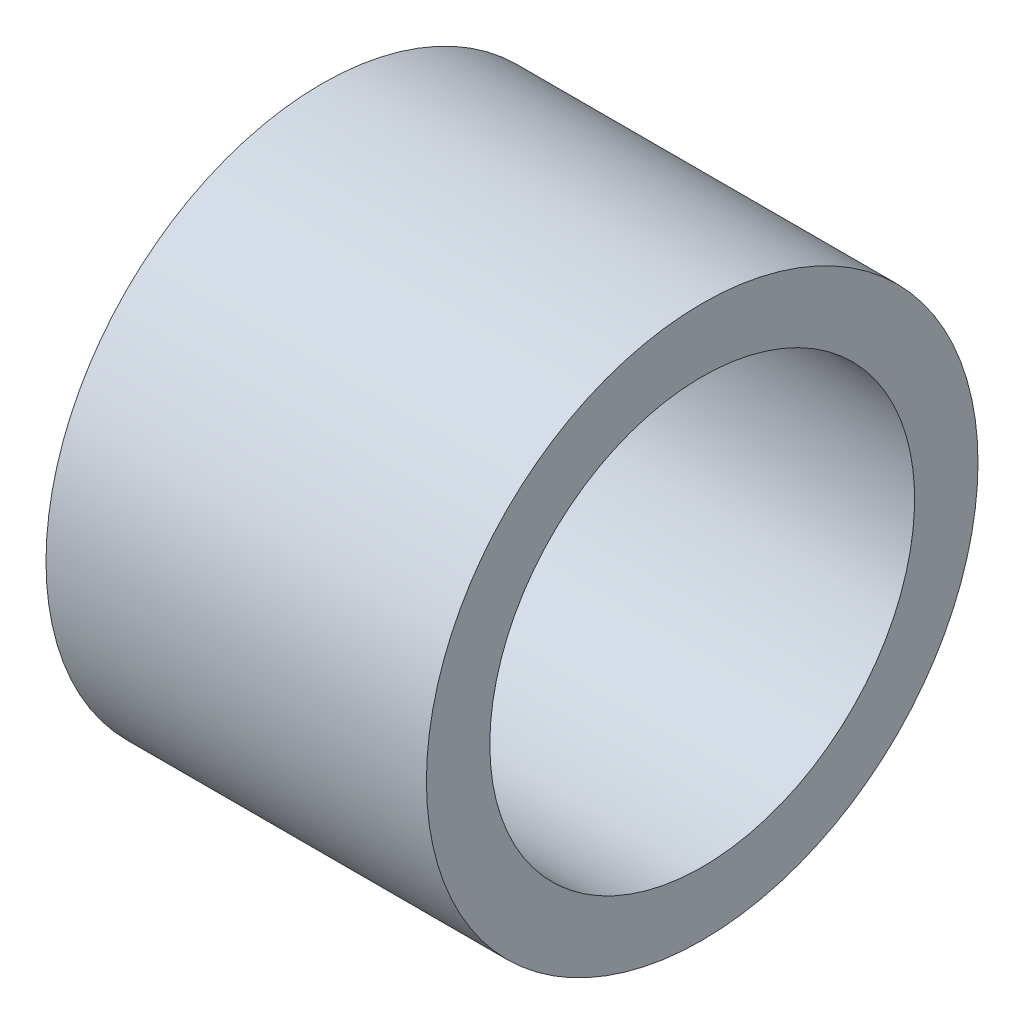
ISO-10303-21;
HEADER;
FILE_DESCRIPTION(('STEP AP214'),'2;1');
FILE_NAME('part.step','',(''),(''),'','','');
FILE_SCHEMA(('AUTOMOTIVE_DESIGN { 1 0 10303 214 1 1 1 1 }'));
ENDSEC;
DATA;
#1=APPLICATION_CONTEXT('core data for automotive mechanical design processes');
#2=APPLICATION_PROTOCOL_DEFINITION('international standard','automotive_design',2000,#1);
#3=PRODUCT_CONTEXT('',#1,'mechanical');
#4=PRODUCT('Part','Part','',(#3));
#5=PRODUCT_RELATED_PRODUCT_CATEGORY('part','',(#4));
#6=PRODUCT_DEFINITION_FORMATION('','',#4);
#7=PRODUCT_DEFINITION_CONTEXT('part definition',#1,'design');
#8=PRODUCT_DEFINITION('design','',#6,#7);
#9=PRODUCT_DEFINITION_SHAPE('','',#8);
#10=(LENGTH_UNIT() NAMED_UNIT(*) SI_UNIT(.MILLI.,.METRE.));
#11=(NAMED_UNIT(*) PLANE_ANGLE_UNIT() SI_UNIT($,.RADIAN.));
#12=(NAMED_UNIT(*) SI_UNIT($,.STERADIAN.) SOLID_ANGLE_UNIT());
#13=UNCERTAINTY_MEASURE_WITH_UNIT(LENGTH_MEASURE(1.E-05),#10,'distance_accuracy_value','');
#14=(GEOMETRIC_REPRESENTATION_CONTEXT(3) GLOBAL_UNCERTAINTY_ASSIGNED_CONTEXT((#13)) GLOBAL_UNIT_ASSIGNED_CONTEXT((#10,
#11,#12)) REPRESENTATION_CONTEXT('',''));
#15=CARTESIAN_POINT('',(0.,0.,0.));
#16=DIRECTION('',(0.,0.,1.));
#17=DIRECTION('',(1.,0.,0.));
#18=AXIS2_PLACEMENT_3D('',#15,#16,#17);
#19=CARTESIAN_POINT('',(-1.,0.999999999999999,0.));
#20=DIRECTION('',(1.,0.,0.));
#21=DIRECTION('',(0.,0.,-1.));
#22=AXIS2_PLACEMENT_3D('',#19,#20,#21);
#23=PLANE('',#22);
#24=CARTESIAN_POINT('',(-1.,0.,0.));
#25=DIRECTION('',(-1.,0.,0.));
#26=DIRECTION('',(0.,0.,1.));
#27=AXIS2_PLACEMENT_3D('',#24,#25,#26);
#28=CIRCLE('',#27,0.999999999999999);
#29=CARTESIAN_POINT('',(-1.,0.,0.999999999999999));
#30=VERTEX_POINT('',#29);
#31=EDGE_CURVE('E10',#30,#30,#28,.T.);
#32=ORIENTED_EDGE('',*,*,#31,.F.);
#33=EDGE_LOOP('',(#32));
#34=FACE_BOUND('',#33,.T.);
#35=CARTESIAN_POINT('',(-1.,0.,0.));
#36=DIRECTION('',(-1.,0.,0.));
#37=DIRECTION('',(0.,0.,1.));
#38=AXIS2_PLACEMENT_3D('',#35,#36,#37);
#39=CIRCLE('',#38,2.);
#40=CARTESIAN_POINT('',(-1.,0.,2.));
#41=VERTEX_POINT('',#40);
#42=EDGE_CURVE('E39',#41,#41,#39,.T.);
#43=ORIENTED_EDGE('',*,*,#42,.T.);
#44=EDGE_LOOP('',(#43));
#45=FACE_BOUND('',#44,.T.);
#46=ADVANCED_FACE('F33',(#34,#45),#23,.F.);
#47=CARTESIAN_POINT('',(0.,0.,0.));
#48=DIRECTION('',(1.,0.,0.));
#49=DIRECTION('',(0.,0.,-1.));
#50=AXIS2_PLACEMENT_3D('',#47,#48,#49);
#51=CONICAL_SURFACE('',#50,3.,0.785398163397447);
#52=ORIENTED_EDGE('',*,*,#42,.F.);
#53=EDGE_LOOP('',(#52));
#54=FACE_BOUND('',#53,.T.);
#55=CARTESIAN_POINT('',(0.,0.,0.));
#56=DIRECTION('',(-1.,0.,0.));
#57=DIRECTION('',(0.,0.,1.));
#58=AXIS2_PLACEMENT_3D('',#55,#56,#57);
#59=CIRCLE('',#58,3.);
#60=CARTESIAN_POINT('',(0.,0.,3.));
#61=VERTEX_POINT('',#60);
#62=EDGE_CURVE('E43',#61,#61,#59,.T.);
#63=ORIENTED_EDGE('',*,*,#62,.T.);
#64=EDGE_LOOP('',(#63));
#65=FACE_BOUND('',#64,.T.);
#66=ADVANCED_FACE('F77',(#54,#65),#51,.T.);
#67=CARTESIAN_POINT('',(0.,3.,0.));
#68=DIRECTION('',(1.,0.,0.));
#69=DIRECTION('',(0.,0.,-1.));
#70=AXIS2_PLACEMENT_3D('',#67,#68,#69);
#71=PLANE('',#70);
#72=ORIENTED_EDGE('',*,*,#62,.F.);
#73=EDGE_LOOP('',(#72));
#74=FACE_BOUND('',#73,.T.);
#75=CARTESIAN_POINT('',(0.,0.,0.));
#76=DIRECTION('',(-1.,0.,0.));
#77=DIRECTION('',(0.,0.,1.));
#78=AXIS2_PLACEMENT_3D('',#75,#76,#77);
#79=CIRCLE('',#78,4.35);
#80=CARTESIAN_POINT('',(0.,0.,4.35));
#81=VERTEX_POINT('',#80);
#82=EDGE_CURVE('E47',#81,#81,#79,.T.);
#83=ORIENTED_EDGE('',*,*,#82,.T.);
#84=EDGE_LOOP('',(#83));
#85=FACE_BOUND('',#84,.T.);
#86=ADVANCED_FACE('F82',(#74,#85),#71,.F.);
#87=CARTESIAN_POINT('',(0.,0.,0.));
#88=DIRECTION('',(-1.,0.,0.));
#89=DIRECTION('',(0.,0.,1.));
#90=AXIS2_PLACEMENT_3D('',#87,#88,#89);
#91=CYLINDRICAL_SURFACE('',#90,4.35);
#92=ORIENTED_EDGE('',*,*,#82,.F.);
#93=EDGE_LOOP('',(#92));
#94=FACE_BOUND('',#93,.T.);
#95=CARTESIAN_POINT('',(6.,0.,0.));
#96=DIRECTION('',(-1.,0.,0.));
#97=DIRECTION('',(0.,0.,1.));
#98=AXIS2_PLACEMENT_3D('',#95,#96,#97);
#99=CIRCLE('',#98,4.35);
#100=CARTESIAN_POINT('',(6.,0.,4.35));
#101=VERTEX_POINT('',#100);
#102=EDGE_CURVE('E52',#101,#101,#99,.T.);
#103=ORIENTED_EDGE('',*,*,#102,.T.);
#104=EDGE_LOOP('',(#103));
#105=FACE_BOUND('',#104,.T.);
#106=ADVANCED_FACE('F87',(#94,#105),#91,.T.);
#107=CARTESIAN_POINT('',(6.,4.35,0.));
#108=DIRECTION('',(-1.,0.,0.));
#109=DIRECTION('',(0.,0.,1.));
#110=AXIS2_PLACEMENT_3D('',#107,#108,#109);
#111=PLANE('',#110);
#112=ORIENTED_EDGE('',*,*,#102,.F.);
#113=EDGE_LOOP('',(#112));
#114=FACE_BOUND('',#113,.T.);
#115=CARTESIAN_POINT('',(6.,0.,0.));
#116=DIRECTION('',(-1.,0.,0.));
#117=DIRECTION('',(0.,0.,1.));
#118=AXIS2_PLACEMENT_3D('',#115,#116,#117);
#119=CIRCLE('',#118,3.35);
#120=CARTESIAN_POINT('',(6.,0.,3.35));
#121=VERTEX_POINT('',#120);
#122=EDGE_CURVE('E55',#121,#121,#119,.T.);
#123=ORIENTED_EDGE('',*,*,#122,.T.);
#124=EDGE_LOOP('',(#123));
#125=FACE_BOUND('',#124,.T.);
#126=ADVANCED_FACE('F94',(#114,#125),#111,.F.);
#127=CARTESIAN_POINT('',(0.,0.,0.));
#128=DIRECTION('',(-1.,0.,0.));
#129=DIRECTION('',(0.,0.,1.));
#130=AXIS2_PLACEMENT_3D('',#127,#128,#129);
#131=CYLINDRICAL_SURFACE('',#130,3.35);
#132=ORIENTED_EDGE('',*,*,#122,.F.);
#133=EDGE_LOOP('',(#132));
#134=FACE_BOUND('',#133,.T.);
#135=CARTESIAN_POINT('',(1.,0.,0.));
#136=DIRECTION('',(-1.,0.,0.));
#137=DIRECTION('',(0.,0.,1.));
#138=AXIS2_PLACEMENT_3D('',#135,#136,#137);
#139=CIRCLE('',#138,3.35);
#140=CARTESIAN_POINT('',(1.,0.,3.35));
#141=VERTEX_POINT('',#140);
#142=EDGE_CURVE('E58',#141,#141,#139,.T.);
#143=ORIENTED_EDGE('',*,*,#142,.T.);
#144=EDGE_LOOP('',(#143));
#145=FACE_BOUND('',#144,.T.);
#146=ADVANCED_FACE('F73',(#134,#145),#131,.F.);
#147=CARTESIAN_POINT('',(1.,3.35,0.));
#148=DIRECTION('',(-1.,0.,0.));
#149=DIRECTION('',(0.,0.,1.));
#150=AXIS2_PLACEMENT_3D('',#147,#148,#149);
#151=PLANE('',#150);
#152=ORIENTED_EDGE('',*,*,#142,.F.);
#153=EDGE_LOOP('',(#152));
#154=FACE_BOUND('',#153,.T.);
#155=CARTESIAN_POINT('',(1.,0.,0.));
#156=DIRECTION('',(-1.,0.,0.));
#157=DIRECTION('',(0.,0.,1.));
#158=AXIS2_PLACEMENT_3D('',#155,#156,#157);
#159=CIRCLE('',#158,1.);
#160=CARTESIAN_POINT('',(1.,0.,1.));
#161=VERTEX_POINT('',#160);
#162=EDGE_CURVE('E61',#161,#161,#159,.T.);
#163=ORIENTED_EDGE('',*,*,#162,.T.);
#164=EDGE_LOOP('',(#163));
#165=FACE_BOUND('',#164,.T.);
#166=ADVANCED_FACE('F65',(#154,#165),#151,.F.);
#167=CARTESIAN_POINT('',(0.,0.,0.));
#168=DIRECTION('',(-1.,0.,0.));
#169=DIRECTION('',(0.,0.,1.));
#170=AXIS2_PLACEMENT_3D('',#167,#168,#169);
#171=CYLINDRICAL_SURFACE('',#170,1.);
#172=ORIENTED_EDGE('',*,*,#162,.F.);
#173=EDGE_LOOP('',(#172));
#174=FACE_BOUND('',#173,.T.);
#175=ORIENTED_EDGE('',*,*,#31,.T.);
#176=EDGE_LOOP('',(#175));
#177=FACE_BOUND('',#176,.T.);
#178=ADVANCED_FACE('F67',(#174,#177),#171,.F.);
#179=CLOSED_SHELL('',(#46,#66,#86,#106,#126,#146,#166,#178));
#180=MANIFOLD_SOLID_BREP('B2',#179);
#181=ADVANCED_BREP_SHAPE_REPRESENTATION('',(#18,#180),#14);
#182=SHAPE_DEFINITION_REPRESENTATION(#9,#181);
ENDSEC;
END-ISO-10303-21;
